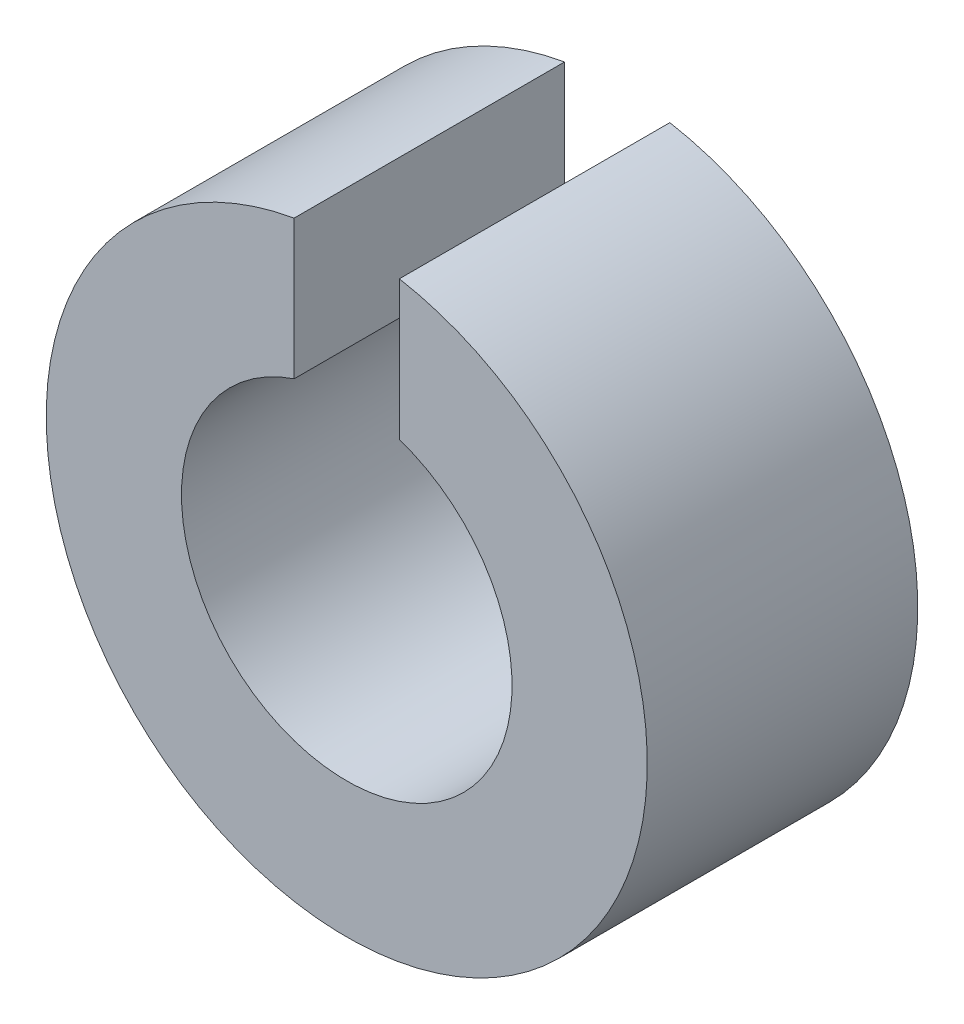
ISO-10303-21;
HEADER;
FILE_DESCRIPTION(('STEP AP214'),'2;1');
FILE_NAME('part.step','',(''),(''),'','','');
FILE_SCHEMA(('AUTOMOTIVE_DESIGN { 1 0 10303 214 1 1 1 1 }'));
ENDSEC;
DATA;
#1=APPLICATION_CONTEXT('core data for automotive mechanical design processes');
#2=APPLICATION_PROTOCOL_DEFINITION('international standard','automotive_design',2000,#1);
#3=PRODUCT_CONTEXT('',#1,'mechanical');
#4=PRODUCT('Part','Part','',(#3));
#5=PRODUCT_RELATED_PRODUCT_CATEGORY('part','',(#4));
#6=PRODUCT_DEFINITION_FORMATION('','',#4);
#7=PRODUCT_DEFINITION_CONTEXT('part definition',#1,'design');
#8=PRODUCT_DEFINITION('design','',#6,#7);
#9=PRODUCT_DEFINITION_SHAPE('','',#8);
#10=(LENGTH_UNIT() NAMED_UNIT(*) SI_UNIT(.MILLI.,.METRE.));
#11=(NAMED_UNIT(*) PLANE_ANGLE_UNIT() SI_UNIT($,.RADIAN.));
#12=(NAMED_UNIT(*) SI_UNIT($,.STERADIAN.) SOLID_ANGLE_UNIT());
#13=UNCERTAINTY_MEASURE_WITH_UNIT(LENGTH_MEASURE(1.E-05),#10,'distance_accuracy_value','');
#14=(GEOMETRIC_REPRESENTATION_CONTEXT(3) GLOBAL_UNCERTAINTY_ASSIGNED_CONTEXT((#13)) GLOBAL_UNIT_ASSIGNED_CONTEXT((#10,
#11,#12)) REPRESENTATION_CONTEXT('',''));
#15=CARTESIAN_POINT('',(0.,0.,0.));
#16=DIRECTION('',(0.,0.,1.));
#17=DIRECTION('',(1.,0.,0.));
#18=AXIS2_PLACEMENT_3D('',#15,#16,#17);
#19=CARTESIAN_POINT('',(0.,0.,9.));
#20=DIRECTION('',(0.,0.,1.));
#21=DIRECTION('',(1.00000000000001,0.,0.));
#22=AXIS2_PLACEMENT_3D('',#19,#20,#21);
#23=PLANE('',#22);
#24=DIRECTION('',(0.,1.00000000000001,0.));
#25=VECTOR('',#24,1.);
#26=CARTESIAN_POINT('',(1.75000000000002,17.5000000000002,9.));
#27=LINE('',#26,#25);
#28=CARTESIAN_POINT('',(1.75000000000002,5.21416340365359,9.));
#29=VERTEX_POINT('',#28);
#30=CARTESIAN_POINT('',(1.75000000000002,9.84568433375769,9.));
#31=VERTEX_POINT('',#30);
#32=EDGE_CURVE('E73',#29,#31,#27,.T.);
#33=ORIENTED_EDGE('',*,*,#32,.F.);
#34=CARTESIAN_POINT('',(0.,0.,9.));
#35=DIRECTION('',(0.,0.,1.));
#36=DIRECTION('',(1.00000000000001,0.,0.));
#37=AXIS2_PLACEMENT_3D('',#34,#35,#36);
#38=CIRCLE('',#37,5.5);
#39=CARTESIAN_POINT('',(-1.75000000000002,5.21416340365359,9.));
#40=VERTEX_POINT('',#39);
#41=EDGE_CURVE('E82',#40,#29,#38,.T.);
#42=ORIENTED_EDGE('',*,*,#41,.F.);
#43=DIRECTION('',(0.,-1.00000000000001,0.));
#44=VECTOR('',#43,1.);
#45=CARTESIAN_POINT('',(-1.75000000000002,17.5000000000002,9.));
#46=LINE('',#45,#44);
#47=CARTESIAN_POINT('',(-1.75000000000002,9.84568433375769,9.));
#48=VERTEX_POINT('',#47);
#49=EDGE_CURVE('E56',#48,#40,#46,.T.);
#50=ORIENTED_EDGE('',*,*,#49,.F.);
#51=CARTESIAN_POINT('',(0.,0.,9.));
#52=DIRECTION('',(0.,0.,1.));
#53=DIRECTION('',(1.00000000000001,0.,0.));
#54=AXIS2_PLACEMENT_3D('',#51,#52,#53);
#55=CIRCLE('',#54,10.);
#56=EDGE_CURVE('E84',#48,#31,#55,.T.);
#57=ORIENTED_EDGE('',*,*,#56,.T.);
#58=EDGE_LOOP('',(#33,#42,#50,#57));
#59=FACE_BOUND('',#58,.T.);
#60=ADVANCED_FACE('F34',(#59),#23,.T.);
#61=CARTESIAN_POINT('',(0.,0.,0.));
#62=DIRECTION('',(0.,0.,1.));
#63=DIRECTION('',(1.00000000000001,0.,0.));
#64=AXIS2_PLACEMENT_3D('',#61,#62,#63);
#65=PLANE('',#64);
#66=CARTESIAN_POINT('',(0.,0.,0.));
#67=DIRECTION('',(0.,0.,1.));
#68=DIRECTION('',(1.00000000000001,0.,0.));
#69=AXIS2_PLACEMENT_3D('',#66,#67,#68);
#70=CIRCLE('',#69,5.5);
#71=CARTESIAN_POINT('',(-1.75000000000002,5.21416340365359,0.));
#72=VERTEX_POINT('',#71);
#73=CARTESIAN_POINT('',(1.75000000000002,5.21416340365359,0.));
#74=VERTEX_POINT('',#73);
#75=EDGE_CURVE('E88',#72,#74,#70,.T.);
#76=ORIENTED_EDGE('',*,*,#75,.T.);
#77=DIRECTION('',(0.,1.00000000000001,0.));
#78=VECTOR('',#77,1.);
#79=CARTESIAN_POINT('',(1.75000000000002,17.5000000000002,0.));
#80=LINE('',#79,#78);
#81=CARTESIAN_POINT('',(1.75000000000002,9.84568433375769,0.));
#82=VERTEX_POINT('',#81);
#83=EDGE_CURVE('E48',#74,#82,#80,.T.);
#84=ORIENTED_EDGE('',*,*,#83,.T.);
#85=CARTESIAN_POINT('',(0.,0.,0.));
#86=DIRECTION('',(0.,0.,1.));
#87=DIRECTION('',(1.00000000000001,0.,0.));
#88=AXIS2_PLACEMENT_3D('',#85,#86,#87);
#89=CIRCLE('',#88,10.);
#90=CARTESIAN_POINT('',(-1.75000000000002,9.84568433375769,0.));
#91=VERTEX_POINT('',#90);
#92=EDGE_CURVE('E87',#91,#82,#89,.T.);
#93=ORIENTED_EDGE('',*,*,#92,.F.);
#94=DIRECTION('',(0.,-1.00000000000001,0.));
#95=VECTOR('',#94,1.);
#96=CARTESIAN_POINT('',(-1.75000000000002,17.5000000000002,0.));
#97=LINE('',#96,#95);
#98=EDGE_CURVE('E99',#91,#72,#97,.T.);
#99=ORIENTED_EDGE('',*,*,#98,.T.);
#100=EDGE_LOOP('',(#76,#84,#93,#99));
#101=FACE_BOUND('',#100,.T.);
#102=ADVANCED_FACE('F103',(#101),#65,.F.);
#103=CARTESIAN_POINT('',(0.,0.,9.));
#104=DIRECTION('',(0.,0.,-1.));
#105=DIRECTION('',(-1.00000000000001,0.,0.));
#106=AXIS2_PLACEMENT_3D('',#103,#104,#105);
#107=CYLINDRICAL_SURFACE('',#106,10.);
#108=ORIENTED_EDGE('',*,*,#92,.T.);
#109=DIRECTION('',(0.,0.,-1.));
#110=VECTOR('',#109,1.);
#111=CARTESIAN_POINT('',(1.75000000000002,9.84568433375769,9.));
#112=LINE('',#111,#110);
#113=EDGE_CURVE('E92',#82,#31,#112,.F.);
#114=ORIENTED_EDGE('',*,*,#113,.T.);
#115=ORIENTED_EDGE('',*,*,#56,.F.);
#116=DIRECTION('',(0.,0.,-1.));
#117=VECTOR('',#116,1.);
#118=CARTESIAN_POINT('',(-1.75000000000002,9.84568433375769,9.));
#119=LINE('',#118,#117);
#120=EDGE_CURVE('E104',#48,#91,#119,.T.);
#121=ORIENTED_EDGE('',*,*,#120,.T.);
#122=EDGE_LOOP('',(#108,#114,#115,#121));
#123=FACE_BOUND('',#122,.T.);
#124=ADVANCED_FACE('F36',(#123),#107,.T.);
#125=CARTESIAN_POINT('',(0.,0.,9.));
#126=DIRECTION('',(0.,0.,-1.));
#127=DIRECTION('',(-1.00000000000001,0.,0.));
#128=AXIS2_PLACEMENT_3D('',#125,#126,#127);
#129=CYLINDRICAL_SURFACE('',#128,5.5);
#130=DIRECTION('',(0.,0.,-1.));
#131=VECTOR('',#130,1.);
#132=CARTESIAN_POINT('',(1.75000000000002,5.21416340365359,9.));
#133=LINE('',#132,#131);
#134=EDGE_CURVE('E11',#74,#29,#133,.F.);
#135=ORIENTED_EDGE('',*,*,#134,.F.);
#136=ORIENTED_EDGE('',*,*,#75,.F.);
#137=DIRECTION('',(0.,0.,-1.));
#138=VECTOR('',#137,1.);
#139=CARTESIAN_POINT('',(-1.75000000000002,5.21416340365359,9.));
#140=LINE('',#139,#138);
#141=EDGE_CURVE('E42',#40,#72,#140,.T.);
#142=ORIENTED_EDGE('',*,*,#141,.F.);
#143=ORIENTED_EDGE('',*,*,#41,.T.);
#144=EDGE_LOOP('',(#135,#136,#142,#143));
#145=FACE_BOUND('',#144,.T.);
#146=ADVANCED_FACE('F86',(#145),#129,.F.);
#147=CARTESIAN_POINT('',(-1.75000000000002,17.5000000000002,0.));
#148=DIRECTION('',(-1.00000000000001,0.,0.));
#149=DIRECTION('',(0.,-1.00000000000001,0.));
#150=AXIS2_PLACEMENT_3D('',#147,#148,#149);
#151=PLANE('',#150);
#152=ORIENTED_EDGE('',*,*,#49,.T.);
#153=ORIENTED_EDGE('',*,*,#141,.T.);
#154=ORIENTED_EDGE('',*,*,#98,.F.);
#155=ORIENTED_EDGE('',*,*,#120,.F.);
#156=EDGE_LOOP('',(#152,#153,#154,#155));
#157=FACE_BOUND('',#156,.T.);
#158=ADVANCED_FACE('F98',(#157),#151,.F.);
#159=CARTESIAN_POINT('',(1.75000000000002,17.5000000000002,0.));
#160=DIRECTION('',(1.00000000000001,0.,0.));
#161=DIRECTION('',(0.,1.00000000000001,0.));
#162=AXIS2_PLACEMENT_3D('',#159,#160,#161);
#163=PLANE('',#162);
#164=ORIENTED_EDGE('',*,*,#83,.F.);
#165=ORIENTED_EDGE('',*,*,#134,.T.);
#166=ORIENTED_EDGE('',*,*,#32,.T.);
#167=ORIENTED_EDGE('',*,*,#113,.F.);
#168=EDGE_LOOP('',(#164,#165,#166,#167));
#169=FACE_BOUND('',#168,.T.);
#170=ADVANCED_FACE('F72',(#169),#163,.F.);
#171=CLOSED_SHELL('',(#60,#102,#124,#146,#158,#170));
#172=MANIFOLD_SOLID_BREP('B2',#171);
#173=ADVANCED_BREP_SHAPE_REPRESENTATION('',(#18,#172),#14);
#174=SHAPE_DEFINITION_REPRESENTATION(#9,#173);
ENDSEC;
END-ISO-10303-21;
